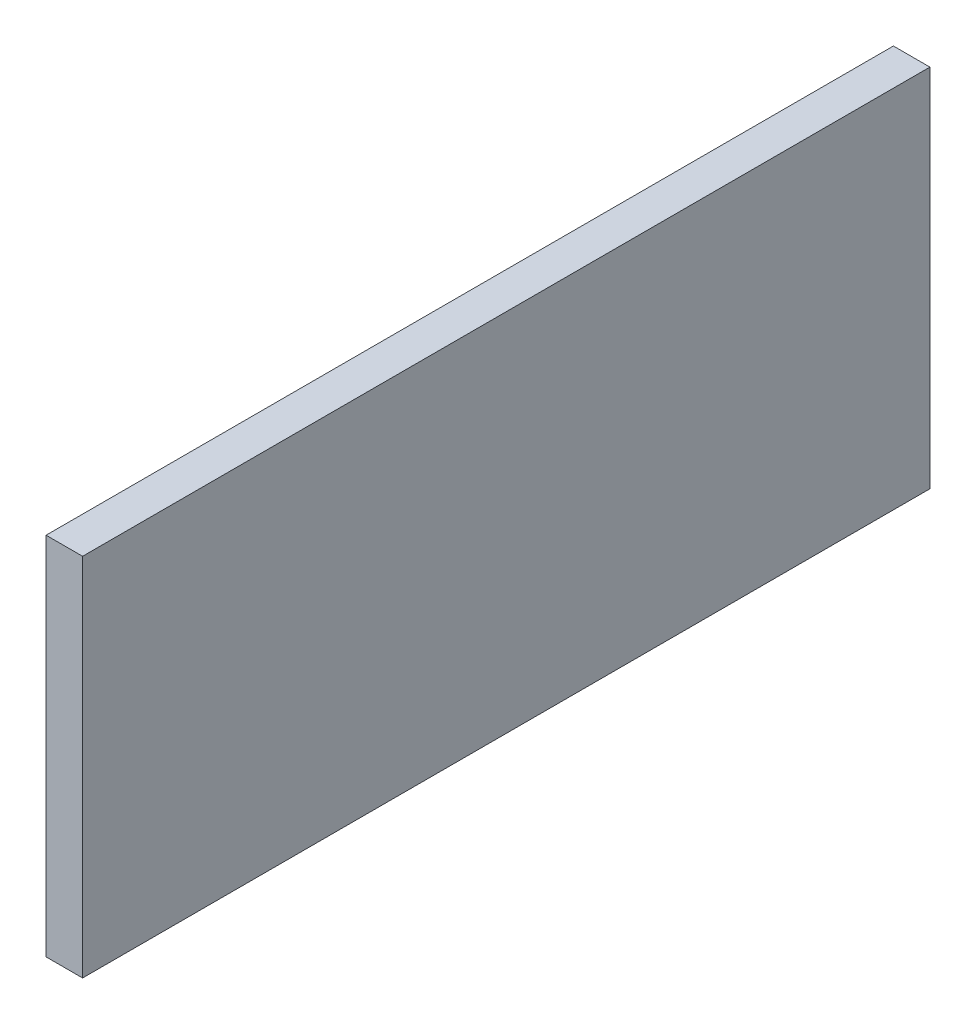
ISO-10303-21;
HEADER;
FILE_DESCRIPTION(('STEP AP214'),'2;1');
FILE_NAME('part.step','',(''),(''),'','','');
FILE_SCHEMA(('AUTOMOTIVE_DESIGN { 1 0 10303 214 1 1 1 1 }'));
ENDSEC;
DATA;
#1=APPLICATION_CONTEXT('core data for automotive mechanical design processes');
#2=APPLICATION_PROTOCOL_DEFINITION('international standard','automotive_design',2000,#1);
#3=PRODUCT_CONTEXT('',#1,'mechanical');
#4=PRODUCT('Part','Part','',(#3));
#5=PRODUCT_RELATED_PRODUCT_CATEGORY('part','',(#4));
#6=PRODUCT_DEFINITION_FORMATION('','',#4);
#7=PRODUCT_DEFINITION_CONTEXT('part definition',#1,'design');
#8=PRODUCT_DEFINITION('design','',#6,#7);
#9=PRODUCT_DEFINITION_SHAPE('','',#8);
#10=(LENGTH_UNIT() NAMED_UNIT(*) SI_UNIT(.MILLI.,.METRE.));
#11=(NAMED_UNIT(*) PLANE_ANGLE_UNIT() SI_UNIT($,.RADIAN.));
#12=(NAMED_UNIT(*) SI_UNIT($,.STERADIAN.) SOLID_ANGLE_UNIT());
#13=UNCERTAINTY_MEASURE_WITH_UNIT(LENGTH_MEASURE(1.E-05),#10,'distance_accuracy_value','');
#14=(GEOMETRIC_REPRESENTATION_CONTEXT(3) GLOBAL_UNCERTAINTY_ASSIGNED_CONTEXT((#13)) GLOBAL_UNIT_ASSIGNED_CONTEXT((#10,
#11,#12)) REPRESENTATION_CONTEXT('',''));
#15=CARTESIAN_POINT('',(0.,0.,0.));
#16=DIRECTION('',(0.,0.,1.));
#17=DIRECTION('',(1.,0.,0.));
#18=AXIS2_PLACEMENT_3D('',#15,#16,#17);
#19=CARTESIAN_POINT('',(48.4632,-31.75,36.83));
#20=DIRECTION('',(0.,0.,-1.));
#21=DIRECTION('',(-1.,0.,0.));
#22=AXIS2_PLACEMENT_3D('',#19,#20,#21);
#23=PLANE('',#22);
#24=DIRECTION('',(-1.,0.,0.));
#25=VECTOR('',#24,1.);
#26=CARTESIAN_POINT('',(48.4632,0.,36.83));
#27=LINE('',#26,#25);
#28=CARTESIAN_POINT('',(48.4632,0.,36.83));
#29=VERTEX_POINT('',#28);
#30=CARTESIAN_POINT('',(45.2882,0.,36.83));
#31=VERTEX_POINT('',#30);
#32=EDGE_CURVE('E95',#29,#31,#27,.T.);
#33=ORIENTED_EDGE('',*,*,#32,.T.);
#34=DIRECTION('',(0.,1.,0.));
#35=VECTOR('',#34,1.);
#36=CARTESIAN_POINT('',(45.2882,-31.75,36.83));
#37=LINE('',#36,#35);
#38=CARTESIAN_POINT('',(45.2882,-31.75,36.83));
#39=VERTEX_POINT('',#38);
#40=EDGE_CURVE('E11',#39,#31,#37,.T.);
#41=ORIENTED_EDGE('',*,*,#40,.F.);
#42=DIRECTION('',(-1.,0.,0.));
#43=VECTOR('',#42,1.);
#44=CARTESIAN_POINT('',(48.4632,-31.75,36.83));
#45=LINE('',#44,#43);
#46=CARTESIAN_POINT('',(48.4632,-31.75,36.83));
#47=VERTEX_POINT('',#46);
#48=EDGE_CURVE('E83',#47,#39,#45,.T.);
#49=ORIENTED_EDGE('',*,*,#48,.F.);
#50=DIRECTION('',(0.,1.,0.));
#51=VECTOR('',#50,1.);
#52=CARTESIAN_POINT('',(48.4632,-31.75,36.83));
#53=LINE('',#52,#51);
#54=EDGE_CURVE('E91',#47,#29,#53,.T.);
#55=ORIENTED_EDGE('',*,*,#54,.T.);
#56=EDGE_LOOP('',(#33,#41,#49,#55));
#57=FACE_BOUND('',#56,.T.);
#58=ADVANCED_FACE('F32',(#57),#23,.F.);
#59=CARTESIAN_POINT('',(45.2882,-31.75,36.83));
#60=DIRECTION('',(1.,0.,0.));
#61=DIRECTION('',(0.,0.,-1.));
#62=AXIS2_PLACEMENT_3D('',#59,#60,#61);
#63=PLANE('',#62);
#64=DIRECTION('',(0.,0.,-1.));
#65=VECTOR('',#64,1.);
#66=CARTESIAN_POINT('',(45.2882,0.,36.83));
#67=LINE('',#66,#65);
#68=CARTESIAN_POINT('',(45.2882,0.,-36.83));
#69=VERTEX_POINT('',#68);
#70=EDGE_CURVE('E87',#31,#69,#67,.T.);
#71=ORIENTED_EDGE('',*,*,#70,.T.);
#72=DIRECTION('',(0.,1.,0.));
#73=VECTOR('',#72,1.);
#74=CARTESIAN_POINT('',(45.2882,-31.75,-36.83));
#75=LINE('',#74,#73);
#76=CARTESIAN_POINT('',(45.2882,-31.75,-36.83));
#77=VERTEX_POINT('',#76);
#78=EDGE_CURVE('E40',#77,#69,#75,.T.);
#79=ORIENTED_EDGE('',*,*,#78,.F.);
#80=DIRECTION('',(0.,0.,-1.));
#81=VECTOR('',#80,1.);
#82=CARTESIAN_POINT('',(45.2882,-31.75,36.83));
#83=LINE('',#82,#81);
#84=EDGE_CURVE('E78',#39,#77,#83,.T.);
#85=ORIENTED_EDGE('',*,*,#84,.F.);
#86=ORIENTED_EDGE('',*,*,#40,.T.);
#87=EDGE_LOOP('',(#71,#79,#85,#86));
#88=FACE_BOUND('',#87,.T.);
#89=ADVANCED_FACE('F86',(#88),#63,.F.);
#90=CARTESIAN_POINT('',(48.4632,-31.75,-36.83));
#91=DIRECTION('',(0.,0.,1.));
#92=DIRECTION('',(1.,0.,0.));
#93=AXIS2_PLACEMENT_3D('',#90,#91,#92);
#94=PLANE('',#93);
#95=DIRECTION('',(1.,0.,0.));
#96=VECTOR('',#95,1.);
#97=CARTESIAN_POINT('',(48.4632,0.,-36.83));
#98=LINE('',#97,#96);
#99=CARTESIAN_POINT('',(48.4632,0.,-36.83));
#100=VERTEX_POINT('',#99);
#101=EDGE_CURVE('E65',#69,#100,#98,.T.);
#102=ORIENTED_EDGE('',*,*,#101,.T.);
#103=DIRECTION('',(0.,1.,0.));
#104=VECTOR('',#103,1.);
#105=CARTESIAN_POINT('',(48.4632,-31.75,-36.83));
#106=LINE('',#105,#104);
#107=CARTESIAN_POINT('',(48.4632,-31.75,-36.83));
#108=VERTEX_POINT('',#107);
#109=EDGE_CURVE('E88',#108,#100,#106,.T.);
#110=ORIENTED_EDGE('',*,*,#109,.F.);
#111=DIRECTION('',(1.,0.,0.));
#112=VECTOR('',#111,1.);
#113=CARTESIAN_POINT('',(48.4632,-31.75,-36.83));
#114=LINE('',#113,#112);
#115=EDGE_CURVE('E81',#77,#108,#114,.T.);
#116=ORIENTED_EDGE('',*,*,#115,.F.);
#117=ORIENTED_EDGE('',*,*,#78,.T.);
#118=EDGE_LOOP('',(#102,#110,#116,#117));
#119=FACE_BOUND('',#118,.T.);
#120=ADVANCED_FACE('F89',(#119),#94,.F.);
#121=CARTESIAN_POINT('',(48.4632,-31.75,36.83));
#122=DIRECTION('',(-1.,0.,0.));
#123=DIRECTION('',(0.,0.,1.));
#124=AXIS2_PLACEMENT_3D('',#121,#122,#123);
#125=PLANE('',#124);
#126=DIRECTION('',(0.,0.,1.));
#127=VECTOR('',#126,1.);
#128=CARTESIAN_POINT('',(48.4632,0.,36.83));
#129=LINE('',#128,#127);
#130=EDGE_CURVE('E71',#100,#29,#129,.T.);
#131=ORIENTED_EDGE('',*,*,#130,.T.);
#132=ORIENTED_EDGE('',*,*,#54,.F.);
#133=DIRECTION('',(0.,0.,1.));
#134=VECTOR('',#133,1.);
#135=CARTESIAN_POINT('',(48.4632,-31.75,36.83));
#136=LINE('',#135,#134);
#137=EDGE_CURVE('E48',#108,#47,#136,.T.);
#138=ORIENTED_EDGE('',*,*,#137,.F.);
#139=ORIENTED_EDGE('',*,*,#109,.T.);
#140=EDGE_LOOP('',(#131,#132,#138,#139));
#141=FACE_BOUND('',#140,.T.);
#142=ADVANCED_FACE('F102',(#141),#125,.F.);
#143=CARTESIAN_POINT('',(0.,-31.75,0.));
#144=DIRECTION('',(0.,-1.,0.));
#145=DIRECTION('',(0.,0.,-1.));
#146=AXIS2_PLACEMENT_3D('',#143,#144,#145);
#147=PLANE('',#146);
#148=ORIENTED_EDGE('',*,*,#48,.T.);
#149=ORIENTED_EDGE('',*,*,#84,.T.);
#150=ORIENTED_EDGE('',*,*,#115,.T.);
#151=ORIENTED_EDGE('',*,*,#137,.T.);
#152=EDGE_LOOP('',(#148,#149,#150,#151));
#153=FACE_BOUND('',#152,.T.);
#154=ADVANCED_FACE('F79',(#153),#147,.T.);
#155=CARTESIAN_POINT('',(0.,0.,0.));
#156=DIRECTION('',(0.,-1.,0.));
#157=DIRECTION('',(0.,0.,-1.));
#158=AXIS2_PLACEMENT_3D('',#155,#156,#157);
#159=PLANE('',#158);
#160=ORIENTED_EDGE('',*,*,#32,.F.);
#161=ORIENTED_EDGE('',*,*,#130,.F.);
#162=ORIENTED_EDGE('',*,*,#101,.F.);
#163=ORIENTED_EDGE('',*,*,#70,.F.);
#164=EDGE_LOOP('',(#160,#161,#162,#163));
#165=FACE_BOUND('',#164,.T.);
#166=ADVANCED_FACE('F105',(#165),#159,.F.);
#167=CLOSED_SHELL('',(#58,#89,#120,#142,#154,#166));
#168=MANIFOLD_SOLID_BREP('B2',#167);
#169=ADVANCED_BREP_SHAPE_REPRESENTATION('',(#18,#168),#14);
#170=SHAPE_DEFINITION_REPRESENTATION(#9,#169);
ENDSEC;
END-ISO-10303-21;
